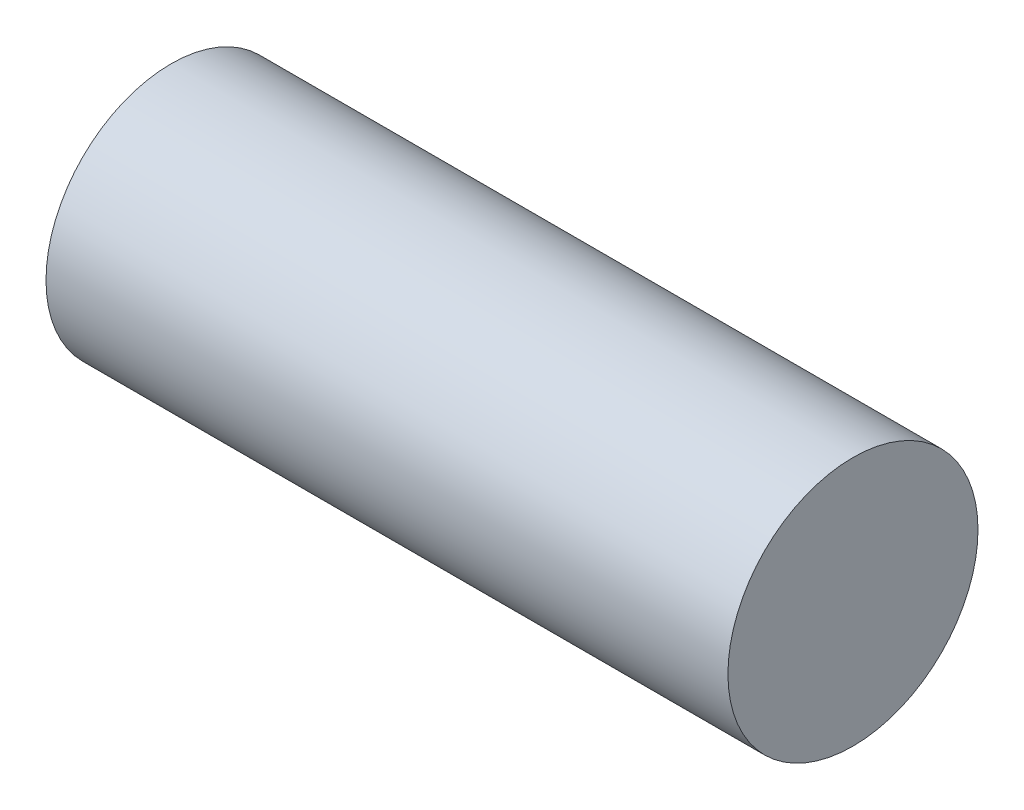
ISO-10303-21;
HEADER;
FILE_DESCRIPTION(('STEP AP214'),'2;1');
FILE_NAME('part.step','',(''),(''),'','','');
FILE_SCHEMA(('AUTOMOTIVE_DESIGN { 1 0 10303 214 1 1 1 1 }'));
ENDSEC;
DATA;
#1=APPLICATION_CONTEXT('core data for automotive mechanical design processes');
#2=APPLICATION_PROTOCOL_DEFINITION('international standard','automotive_design',2000,#1);
#3=PRODUCT_CONTEXT('',#1,'mechanical');
#4=PRODUCT('Part','Part','',(#3));
#5=PRODUCT_RELATED_PRODUCT_CATEGORY('part','',(#4));
#6=PRODUCT_DEFINITION_FORMATION('','',#4);
#7=PRODUCT_DEFINITION_CONTEXT('part definition',#1,'design');
#8=PRODUCT_DEFINITION('design','',#6,#7);
#9=PRODUCT_DEFINITION_SHAPE('','',#8);
#10=(LENGTH_UNIT() NAMED_UNIT(*) SI_UNIT(.MILLI.,.METRE.));
#11=(NAMED_UNIT(*) PLANE_ANGLE_UNIT() SI_UNIT($,.RADIAN.));
#12=(NAMED_UNIT(*) SI_UNIT($,.STERADIAN.) SOLID_ANGLE_UNIT());
#13=UNCERTAINTY_MEASURE_WITH_UNIT(LENGTH_MEASURE(1.E-05),#10,'distance_accuracy_value','');
#14=(GEOMETRIC_REPRESENTATION_CONTEXT(3) GLOBAL_UNCERTAINTY_ASSIGNED_CONTEXT((#13)) GLOBAL_UNIT_ASSIGNED_CONTEXT((#10,
#11,#12)) REPRESENTATION_CONTEXT('',''));
#15=CARTESIAN_POINT('',(0.,0.,0.));
#16=DIRECTION('',(0.,0.,1.));
#17=DIRECTION('',(1.,0.,0.));
#18=AXIS2_PLACEMENT_3D('',#15,#16,#17);
#19=CARTESIAN_POINT('',(210.,0.,0.));
#20=DIRECTION('',(-1.,0.,0.));
#21=DIRECTION('',(0.,0.,1.));
#22=AXIS2_PLACEMENT_3D('',#19,#20,#21);
#23=CYLINDRICAL_SURFACE('',#22,38.1);
#24=CARTESIAN_POINT('',(2.19999999999933,0.,0.));
#25=DIRECTION('',(1.,0.,0.));
#26=DIRECTION('',(0.,0.,-1.));
#27=AXIS2_PLACEMENT_3D('',#24,#25,#26);
#28=CIRCLE('',#27,38.1);
#29=CARTESIAN_POINT('',(2.19999999999932,0.,-38.1));
#30=VERTEX_POINT('',#29);
#31=EDGE_CURVE('E39',#30,#30,#28,.F.);
#32=ORIENTED_EDGE('',*,*,#31,.F.);
#33=EDGE_LOOP('',(#32));
#34=FACE_BOUND('',#33,.T.);
#35=CARTESIAN_POINT('',(210.,0.,0.));
#36=DIRECTION('',(1.,0.,0.));
#37=DIRECTION('',(0.,0.,-1.));
#38=AXIS2_PLACEMENT_3D('',#35,#36,#37);
#39=CIRCLE('',#38,38.1);
#40=CARTESIAN_POINT('',(210.,0.,-38.1));
#41=VERTEX_POINT('',#40);
#42=EDGE_CURVE('E10',#41,#41,#39,.T.);
#43=ORIENTED_EDGE('',*,*,#42,.F.);
#44=EDGE_LOOP('',(#43));
#45=FACE_BOUND('',#44,.T.);
#46=ADVANCED_FACE('F33',(#34,#45),#23,.T.);
#47=CARTESIAN_POINT('',(210.,0.,0.));
#48=DIRECTION('',(1.,0.,0.));
#49=DIRECTION('',(0.,0.,-1.));
#50=AXIS2_PLACEMENT_3D('',#47,#48,#49);
#51=PLANE('',#50);
#52=ORIENTED_EDGE('',*,*,#42,.T.);
#53=EDGE_LOOP('',(#52));
#54=FACE_BOUND('',#53,.T.);
#55=ADVANCED_FACE('F49',(#54),#51,.T.);
#56=CARTESIAN_POINT('',(2.19999999999933,-135.712302863017,-129.87138934901));
#57=DIRECTION('',(1.,0.,0.));
#58=DIRECTION('',(0.,0.406448551479731,-0.913673669862511));
#59=AXIS2_PLACEMENT_3D('',#56,#57,#58);
#60=PLANE('',#59);
#61=ORIENTED_EDGE('',*,*,#31,.T.);
#62=EDGE_LOOP('',(#61));
#63=FACE_BOUND('',#62,.T.);
#64=ADVANCED_FACE('F45',(#63),#60,.F.);
#65=CLOSED_SHELL('',(#46,#55,#64));
#66=MANIFOLD_SOLID_BREP('B2',#65);
#67=ADVANCED_BREP_SHAPE_REPRESENTATION('',(#18,#66),#14);
#68=SHAPE_DEFINITION_REPRESENTATION(#9,#67);
ENDSEC;
END-ISO-10303-21;
